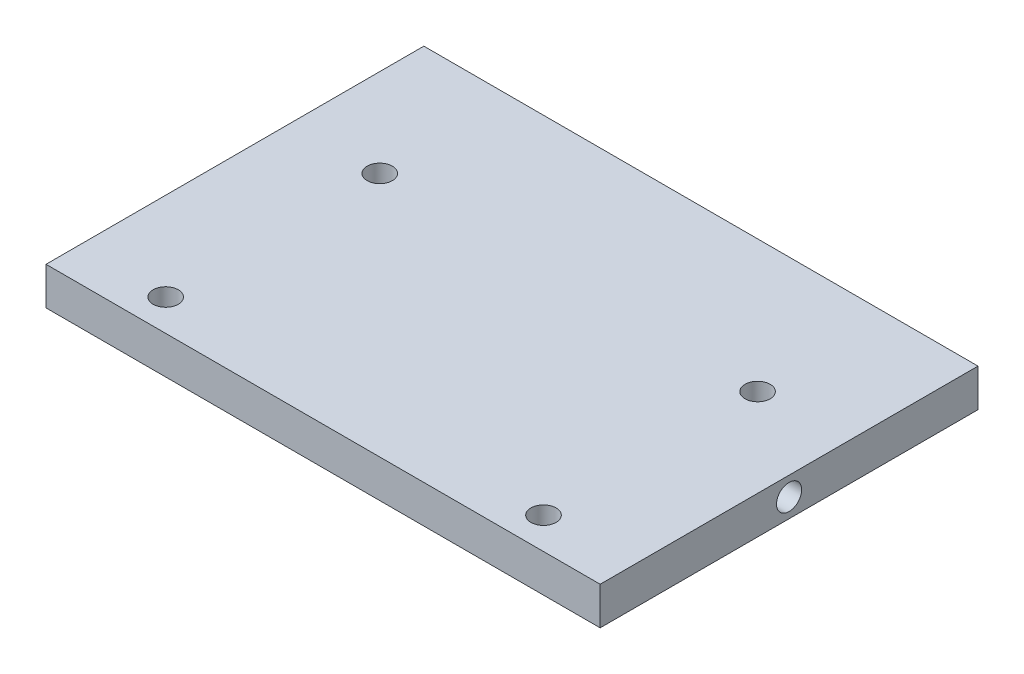
ISO-10303-21;
HEADER;
FILE_DESCRIPTION(('STEP AP214'),'2;1');
FILE_NAME('part.step','',(''),(''),'','','');
FILE_SCHEMA(('AUTOMOTIVE_DESIGN { 1 0 10303 214 1 1 1 1 }'));
ENDSEC;
DATA;
#1=APPLICATION_CONTEXT('core data for automotive mechanical design processes');
#2=APPLICATION_PROTOCOL_DEFINITION('international standard','automotive_design',2000,#1);
#3=PRODUCT_CONTEXT('',#1,'mechanical');
#4=PRODUCT('Part','Part','',(#3));
#5=PRODUCT_RELATED_PRODUCT_CATEGORY('part','',(#4));
#6=PRODUCT_DEFINITION_FORMATION('','',#4);
#7=PRODUCT_DEFINITION_CONTEXT('part definition',#1,'design');
#8=PRODUCT_DEFINITION('design','',#6,#7);
#9=PRODUCT_DEFINITION_SHAPE('','',#8);
#10=(LENGTH_UNIT() NAMED_UNIT(*) SI_UNIT(.MILLI.,.METRE.));
#11=(NAMED_UNIT(*) PLANE_ANGLE_UNIT() SI_UNIT($,.RADIAN.));
#12=(NAMED_UNIT(*) SI_UNIT($,.STERADIAN.) SOLID_ANGLE_UNIT());
#13=UNCERTAINTY_MEASURE_WITH_UNIT(LENGTH_MEASURE(1.E-05),#10,'distance_accuracy_value','');
#14=(GEOMETRIC_REPRESENTATION_CONTEXT(3) GLOBAL_UNCERTAINTY_ASSIGNED_CONTEXT((#13)) GLOBAL_UNIT_ASSIGNED_CONTEXT((#10,
#11,#12)) REPRESENTATION_CONTEXT('',''));
#15=CARTESIAN_POINT('',(0.,0.,0.));
#16=DIRECTION('',(0.,0.,1.));
#17=DIRECTION('',(1.,0.,0.));
#18=AXIS2_PLACEMENT_3D('',#15,#16,#17);
#19=CARTESIAN_POINT('',(-22.,3.,-15.));
#20=DIRECTION('',(1.,0.,0.));
#21=DIRECTION('',(0.,0.,-1.));
#22=AXIS2_PLACEMENT_3D('',#19,#20,#21);
#23=PLANE('',#22);
#24=CARTESIAN_POINT('',(-22.,1.5,0.));
#25=DIRECTION('',(-1.,0.,0.));
#26=DIRECTION('',(0.,0.,1.));
#27=AXIS2_PLACEMENT_3D('',#24,#25,#26);
#28=CIRCLE('',#27,1.);
#29=CARTESIAN_POINT('',(-22.,1.5,0.999999999999998));
#30=VERTEX_POINT('',#29);
#31=EDGE_CURVE('E112',#30,#30,#28,.T.);
#32=ORIENTED_EDGE('',*,*,#31,.F.);
#33=EDGE_LOOP('',(#32));
#34=FACE_BOUND('',#33,.T.);
#35=DIRECTION('',(0.,0.,1.));
#36=VECTOR('',#35,1.);
#37=CARTESIAN_POINT('',(-22.,0.,-15.));
#38=LINE('',#37,#36);
#39=CARTESIAN_POINT('',(-22.,0.,-15.));
#40=VERTEX_POINT('',#39);
#41=CARTESIAN_POINT('',(-22.,0.,15.));
#42=VERTEX_POINT('',#41);
#43=EDGE_CURVE('E100',#40,#42,#38,.T.);
#44=ORIENTED_EDGE('',*,*,#43,.T.);
#45=DIRECTION('',(0.,-1.,0.));
#46=VECTOR('',#45,1.);
#47=CARTESIAN_POINT('',(-22.,3.,15.));
#48=LINE('',#47,#46);
#49=CARTESIAN_POINT('',(-22.,3.,15.));
#50=VERTEX_POINT('',#49);
#51=EDGE_CURVE('E11',#50,#42,#48,.T.);
#52=ORIENTED_EDGE('',*,*,#51,.F.);
#53=DIRECTION('',(0.,0.,1.));
#54=VECTOR('',#53,1.);
#55=CARTESIAN_POINT('',(-22.,3.,-15.));
#56=LINE('',#55,#54);
#57=CARTESIAN_POINT('',(-22.,3.,-15.));
#58=VERTEX_POINT('',#57);
#59=EDGE_CURVE('E86',#58,#50,#56,.T.);
#60=ORIENTED_EDGE('',*,*,#59,.F.);
#61=DIRECTION('',(0.,-1.,0.));
#62=VECTOR('',#61,1.);
#63=CARTESIAN_POINT('',(-22.,3.,-15.));
#64=LINE('',#63,#62);
#65=EDGE_CURVE('E53',#58,#40,#64,.T.);
#66=ORIENTED_EDGE('',*,*,#65,.T.);
#67=EDGE_LOOP('',(#44,#52,#60,#66));
#68=FACE_BOUND('',#67,.T.);
#69=ADVANCED_FACE('F37',(#34,#68),#23,.F.);
#70=CARTESIAN_POINT('',(-22.,3.,15.));
#71=DIRECTION('',(0.,0.,-1.));
#72=DIRECTION('',(-1.,0.,0.));
#73=AXIS2_PLACEMENT_3D('',#70,#71,#72);
#74=PLANE('',#73);
#75=DIRECTION('',(1.,0.,0.));
#76=VECTOR('',#75,1.);
#77=CARTESIAN_POINT('',(-22.,0.,15.));
#78=LINE('',#77,#76);
#79=CARTESIAN_POINT('',(22.,0.,15.));
#80=VERTEX_POINT('',#79);
#81=EDGE_CURVE('E91',#42,#80,#78,.T.);
#82=ORIENTED_EDGE('',*,*,#81,.T.);
#83=DIRECTION('',(0.,-1.,0.));
#84=VECTOR('',#83,1.);
#85=CARTESIAN_POINT('',(22.,3.,15.));
#86=LINE('',#85,#84);
#87=CARTESIAN_POINT('',(22.,3.,15.));
#88=VERTEX_POINT('',#87);
#89=EDGE_CURVE('E45',#88,#80,#86,.T.);
#90=ORIENTED_EDGE('',*,*,#89,.F.);
#91=DIRECTION('',(1.,0.,0.));
#92=VECTOR('',#91,1.);
#93=CARTESIAN_POINT('',(-22.,3.,15.));
#94=LINE('',#93,#92);
#95=EDGE_CURVE('E78',#50,#88,#94,.T.);
#96=ORIENTED_EDGE('',*,*,#95,.F.);
#97=ORIENTED_EDGE('',*,*,#51,.T.);
#98=EDGE_LOOP('',(#82,#90,#96,#97));
#99=FACE_BOUND('',#98,.T.);
#100=ADVANCED_FACE('F90',(#99),#74,.F.);
#101=CARTESIAN_POINT('',(22.,3.,-15.));
#102=DIRECTION('',(1.,0.,0.));
#103=DIRECTION('',(0.,0.,-1.));
#104=AXIS2_PLACEMENT_3D('',#101,#102,#103);
#105=PLANE('',#104);
#106=CARTESIAN_POINT('',(22.,1.5,0.));
#107=DIRECTION('',(-1.,0.,0.));
#108=DIRECTION('',(0.,0.,1.));
#109=AXIS2_PLACEMENT_3D('',#106,#107,#108);
#110=CIRCLE('',#109,1.);
#111=CARTESIAN_POINT('',(22.,1.5,0.999999999999998));
#112=VERTEX_POINT('',#111);
#113=EDGE_CURVE('E118',#112,#112,#110,.T.);
#114=ORIENTED_EDGE('',*,*,#113,.T.);
#115=EDGE_LOOP('',(#114));
#116=FACE_BOUND('',#115,.T.);
#117=DIRECTION('',(0.,0.,1.));
#118=VECTOR('',#117,1.);
#119=CARTESIAN_POINT('',(22.,0.,-15.));
#120=LINE('',#119,#118);
#121=CARTESIAN_POINT('',(22.,0.,-15.));
#122=VERTEX_POINT('',#121);
#123=EDGE_CURVE('E104',#122,#80,#120,.T.);
#124=ORIENTED_EDGE('',*,*,#123,.F.);
#125=DIRECTION('',(0.,-1.,0.));
#126=VECTOR('',#125,1.);
#127=CARTESIAN_POINT('',(22.,3.,-15.));
#128=LINE('',#127,#126);
#129=CARTESIAN_POINT('',(22.,3.,-15.));
#130=VERTEX_POINT('',#129);
#131=EDGE_CURVE('E67',#130,#122,#128,.T.);
#132=ORIENTED_EDGE('',*,*,#131,.F.);
#133=DIRECTION('',(0.,0.,1.));
#134=VECTOR('',#133,1.);
#135=CARTESIAN_POINT('',(22.,3.,-15.));
#136=LINE('',#135,#134);
#137=EDGE_CURVE('E85',#130,#88,#136,.T.);
#138=ORIENTED_EDGE('',*,*,#137,.T.);
#139=ORIENTED_EDGE('',*,*,#89,.T.);
#140=EDGE_LOOP('',(#124,#132,#138,#139));
#141=FACE_BOUND('',#140,.T.);
#142=ADVANCED_FACE('F94',(#116,#141),#105,.T.);
#143=CARTESIAN_POINT('',(-22.,3.,-15.));
#144=DIRECTION('',(0.,0.,-1.));
#145=DIRECTION('',(-1.,0.,0.));
#146=AXIS2_PLACEMENT_3D('',#143,#144,#145);
#147=PLANE('',#146);
#148=DIRECTION('',(1.,0.,0.));
#149=VECTOR('',#148,1.);
#150=CARTESIAN_POINT('',(-22.,0.,-15.));
#151=LINE('',#150,#149);
#152=EDGE_CURVE('E106',#40,#122,#151,.T.);
#153=ORIENTED_EDGE('',*,*,#152,.F.);
#154=ORIENTED_EDGE('',*,*,#65,.F.);
#155=DIRECTION('',(1.,0.,0.));
#156=VECTOR('',#155,1.);
#157=CARTESIAN_POINT('',(-22.,3.,-15.));
#158=LINE('',#157,#156);
#159=EDGE_CURVE('E95',#58,#130,#158,.T.);
#160=ORIENTED_EDGE('',*,*,#159,.T.);
#161=ORIENTED_EDGE('',*,*,#131,.T.);
#162=EDGE_LOOP('',(#153,#154,#160,#161));
#163=FACE_BOUND('',#162,.T.);
#164=ADVANCED_FACE('F157',(#163),#147,.T.);
#165=CARTESIAN_POINT('',(0.,3.,0.));
#166=DIRECTION('',(0.,1.,0.));
#167=DIRECTION('',(0.,0.,1.));
#168=AXIS2_PLACEMENT_3D('',#165,#166,#167);
#169=PLANE('',#168);
#170=CARTESIAN_POINT('',(15.,3.,-4.50000000000001));
#171=DIRECTION('',(0.,1.,0.));
#172=DIRECTION('',(0.,0.,1.));
#173=AXIS2_PLACEMENT_3D('',#170,#171,#172);
#174=CIRCLE('',#173,1.);
#175=CARTESIAN_POINT('',(15.,3.,-3.50000000000001));
#176=VERTEX_POINT('',#175);
#177=EDGE_CURVE('E121',#176,#176,#174,.T.);
#178=ORIENTED_EDGE('',*,*,#177,.F.);
#179=EDGE_LOOP('',(#178));
#180=FACE_BOUND('',#179,.T.);
#181=CARTESIAN_POINT('',(15.,3.,12.5));
#182=DIRECTION('',(0.,1.,0.));
#183=DIRECTION('',(0.,0.,1.));
#184=AXIS2_PLACEMENT_3D('',#181,#182,#183);
#185=CIRCLE('',#184,1.);
#186=CARTESIAN_POINT('',(15.,3.,13.5));
#187=VERTEX_POINT('',#186);
#188=EDGE_CURVE('E126',#187,#187,#185,.T.);
#189=ORIENTED_EDGE('',*,*,#188,.F.);
#190=EDGE_LOOP('',(#189));
#191=FACE_BOUND('',#190,.T.);
#192=CARTESIAN_POINT('',(-15.,3.,12.5));
#193=DIRECTION('',(0.,1.,0.));
#194=DIRECTION('',(0.,0.,1.));
#195=AXIS2_PLACEMENT_3D('',#192,#193,#194);
#196=CIRCLE('',#195,1.);
#197=CARTESIAN_POINT('',(-15.,3.,13.5));
#198=VERTEX_POINT('',#197);
#199=EDGE_CURVE('E129',#198,#198,#196,.T.);
#200=ORIENTED_EDGE('',*,*,#199,.F.);
#201=EDGE_LOOP('',(#200));
#202=FACE_BOUND('',#201,.T.);
#203=CARTESIAN_POINT('',(-15.,3.,-4.50000000000001));
#204=DIRECTION('',(0.,1.,0.));
#205=DIRECTION('',(0.,0.,1.));
#206=AXIS2_PLACEMENT_3D('',#203,#204,#205);
#207=CIRCLE('',#206,1.);
#208=CARTESIAN_POINT('',(-15.,3.,-3.50000000000001));
#209=VERTEX_POINT('',#208);
#210=EDGE_CURVE('E132',#209,#209,#207,.T.);
#211=ORIENTED_EDGE('',*,*,#210,.F.);
#212=EDGE_LOOP('',(#211));
#213=FACE_BOUND('',#212,.T.);
#214=ORIENTED_EDGE('',*,*,#59,.T.);
#215=ORIENTED_EDGE('',*,*,#95,.T.);
#216=ORIENTED_EDGE('',*,*,#137,.F.);
#217=ORIENTED_EDGE('',*,*,#159,.F.);
#218=EDGE_LOOP('',(#214,#215,#216,#217));
#219=FACE_BOUND('',#218,.T.);
#220=ADVANCED_FACE('F82',(#180,#191,#202,#213,#219),#169,.T.);
#221=CARTESIAN_POINT('',(0.,0.,0.));
#222=DIRECTION('',(0.,1.,0.));
#223=DIRECTION('',(0.,0.,1.));
#224=AXIS2_PLACEMENT_3D('',#221,#222,#223);
#225=PLANE('',#224);
#226=CARTESIAN_POINT('',(15.,0.,-4.50000000000001));
#227=DIRECTION('',(0.,-1.,0.));
#228=DIRECTION('',(0.,0.,-1.));
#229=AXIS2_PLACEMENT_3D('',#226,#227,#228);
#230=CIRCLE('',#229,1.);
#231=CARTESIAN_POINT('',(15.,0.,-5.50000000000001));
#232=VERTEX_POINT('',#231);
#233=EDGE_CURVE('E139',#232,#232,#230,.T.);
#234=ORIENTED_EDGE('',*,*,#233,.F.);
#235=EDGE_LOOP('',(#234));
#236=FACE_BOUND('',#235,.T.);
#237=CARTESIAN_POINT('',(15.,0.,12.5));
#238=DIRECTION('',(0.,-1.,0.));
#239=DIRECTION('',(0.,0.,-1.));
#240=AXIS2_PLACEMENT_3D('',#237,#238,#239);
#241=CIRCLE('',#240,1.);
#242=CARTESIAN_POINT('',(15.,0.,11.5));
#243=VERTEX_POINT('',#242);
#244=EDGE_CURVE('E142',#243,#243,#241,.T.);
#245=ORIENTED_EDGE('',*,*,#244,.F.);
#246=EDGE_LOOP('',(#245));
#247=FACE_BOUND('',#246,.T.);
#248=CARTESIAN_POINT('',(-15.,0.,12.5));
#249=DIRECTION('',(0.,-1.,0.));
#250=DIRECTION('',(0.,0.,-1.));
#251=AXIS2_PLACEMENT_3D('',#248,#249,#250);
#252=CIRCLE('',#251,1.);
#253=CARTESIAN_POINT('',(-15.,0.,11.5));
#254=VERTEX_POINT('',#253);
#255=EDGE_CURVE('E138',#254,#254,#252,.T.);
#256=ORIENTED_EDGE('',*,*,#255,.F.);
#257=EDGE_LOOP('',(#256));
#258=FACE_BOUND('',#257,.T.);
#259=CARTESIAN_POINT('',(-15.,0.,-4.50000000000001));
#260=DIRECTION('',(0.,-1.,0.));
#261=DIRECTION('',(0.,0.,-1.));
#262=AXIS2_PLACEMENT_3D('',#259,#260,#261);
#263=CIRCLE('',#262,1.);
#264=CARTESIAN_POINT('',(-15.,0.,-5.50000000000001));
#265=VERTEX_POINT('',#264);
#266=EDGE_CURVE('E135',#265,#265,#263,.T.);
#267=ORIENTED_EDGE('',*,*,#266,.F.);
#268=EDGE_LOOP('',(#267));
#269=FACE_BOUND('',#268,.T.);
#270=ORIENTED_EDGE('',*,*,#43,.F.);
#271=ORIENTED_EDGE('',*,*,#152,.T.);
#272=ORIENTED_EDGE('',*,*,#123,.T.);
#273=ORIENTED_EDGE('',*,*,#81,.F.);
#274=EDGE_LOOP('',(#270,#271,#272,#273));
#275=FACE_BOUND('',#274,.T.);
#276=ADVANCED_FACE('F150',(#236,#247,#258,#269,#275),#225,.F.);
#277=CARTESIAN_POINT('',(-17.,1.5,0.));
#278=DIRECTION('',(-1.,0.,0.));
#279=DIRECTION('',(0.,0.,1.));
#280=AXIS2_PLACEMENT_3D('',#277,#278,#279);
#281=CYLINDRICAL_SURFACE('',#280,1.);
#282=CARTESIAN_POINT('',(-17.,1.5,0.));
#283=DIRECTION('',(-1.,0.,0.));
#284=DIRECTION('',(0.,0.,1.));
#285=AXIS2_PLACEMENT_3D('',#282,#283,#284);
#286=CIRCLE('',#285,1.);
#287=CARTESIAN_POINT('',(-17.,1.5,0.999999999999998));
#288=VERTEX_POINT('',#287);
#289=EDGE_CURVE('E102',#288,#288,#286,.T.);
#290=ORIENTED_EDGE('',*,*,#289,.F.);
#291=EDGE_LOOP('',(#290));
#292=FACE_BOUND('',#291,.T.);
#293=ORIENTED_EDGE('',*,*,#31,.T.);
#294=EDGE_LOOP('',(#293));
#295=FACE_BOUND('',#294,.T.);
#296=ADVANCED_FACE('F153',(#292,#295),#281,.F.);
#297=CARTESIAN_POINT('',(-17.,1.5,0.));
#298=DIRECTION('',(-1.,0.,0.));
#299=DIRECTION('',(0.,0.,1.));
#300=AXIS2_PLACEMENT_3D('',#297,#298,#299);
#301=PLANE('',#300);
#302=ORIENTED_EDGE('',*,*,#289,.T.);
#303=EDGE_LOOP('',(#302));
#304=FACE_BOUND('',#303,.T.);
#305=ADVANCED_FACE('F179',(#304),#301,.T.);
#306=CARTESIAN_POINT('',(17.,1.5,0.));
#307=DIRECTION('',(1.,0.,0.));
#308=DIRECTION('',(0.,0.,-1.));
#309=AXIS2_PLACEMENT_3D('',#306,#307,#308);
#310=CYLINDRICAL_SURFACE('',#309,1.);
#311=CARTESIAN_POINT('',(17.,1.5,0.));
#312=DIRECTION('',(-1.,0.,0.));
#313=DIRECTION('',(0.,0.,1.));
#314=AXIS2_PLACEMENT_3D('',#311,#312,#313);
#315=CIRCLE('',#314,1.);
#316=CARTESIAN_POINT('',(17.,1.5,0.999999999999998));
#317=VERTEX_POINT('',#316);
#318=EDGE_CURVE('E115',#317,#317,#315,.T.);
#319=ORIENTED_EDGE('',*,*,#318,.T.);
#320=EDGE_LOOP('',(#319));
#321=FACE_BOUND('',#320,.T.);
#322=ORIENTED_EDGE('',*,*,#113,.F.);
#323=EDGE_LOOP('',(#322));
#324=FACE_BOUND('',#323,.T.);
#325=ADVANCED_FACE('F185',(#321,#324),#310,.F.);
#326=CARTESIAN_POINT('',(17.,1.5,0.));
#327=DIRECTION('',(1.,0.,0.));
#328=DIRECTION('',(0.,0.,1.));
#329=AXIS2_PLACEMENT_3D('',#326,#327,#328);
#330=PLANE('',#329);
#331=ORIENTED_EDGE('',*,*,#318,.F.);
#332=EDGE_LOOP('',(#331));
#333=FACE_BOUND('',#332,.T.);
#334=ADVANCED_FACE('F192',(#333),#330,.T.);
#335=CARTESIAN_POINT('',(-15.,5.,-4.50000000000001));
#336=DIRECTION('',(0.,-1.,0.));
#337=DIRECTION('',(0.,0.,-1.));
#338=AXIS2_PLACEMENT_3D('',#335,#336,#337);
#339=CYLINDRICAL_SURFACE('',#338,1.);
#340=ORIENTED_EDGE('',*,*,#210,.T.);
#341=EDGE_LOOP('',(#340));
#342=FACE_BOUND('',#341,.T.);
#343=ORIENTED_EDGE('',*,*,#266,.T.);
#344=EDGE_LOOP('',(#343));
#345=FACE_BOUND('',#344,.T.);
#346=ADVANCED_FACE('F196',(#342,#345),#339,.F.);
#347=CARTESIAN_POINT('',(-15.,5.,12.5));
#348=DIRECTION('',(0.,-1.,0.));
#349=DIRECTION('',(0.,0.,-1.));
#350=AXIS2_PLACEMENT_3D('',#347,#348,#349);
#351=CYLINDRICAL_SURFACE('',#350,1.);
#352=ORIENTED_EDGE('',*,*,#199,.T.);
#353=EDGE_LOOP('',(#352));
#354=FACE_BOUND('',#353,.T.);
#355=ORIENTED_EDGE('',*,*,#255,.T.);
#356=EDGE_LOOP('',(#355));
#357=FACE_BOUND('',#356,.T.);
#358=ADVANCED_FACE('F148',(#354,#357),#351,.F.);
#359=CARTESIAN_POINT('',(15.,5.,12.5));
#360=DIRECTION('',(0.,-1.,0.));
#361=DIRECTION('',(0.,0.,-1.));
#362=AXIS2_PLACEMENT_3D('',#359,#360,#361);
#363=CYLINDRICAL_SURFACE('',#362,1.);
#364=ORIENTED_EDGE('',*,*,#188,.T.);
#365=EDGE_LOOP('',(#364));
#366=FACE_BOUND('',#365,.T.);
#367=ORIENTED_EDGE('',*,*,#244,.T.);
#368=EDGE_LOOP('',(#367));
#369=FACE_BOUND('',#368,.T.);
#370=ADVANCED_FACE('F204',(#366,#369),#363,.F.);
#371=CARTESIAN_POINT('',(15.,5.,-4.50000000000001));
#372=DIRECTION('',(0.,-1.,0.));
#373=DIRECTION('',(0.,0.,-1.));
#374=AXIS2_PLACEMENT_3D('',#371,#372,#373);
#375=CYLINDRICAL_SURFACE('',#374,1.);
#376=ORIENTED_EDGE('',*,*,#177,.T.);
#377=EDGE_LOOP('',(#376));
#378=FACE_BOUND('',#377,.T.);
#379=ORIENTED_EDGE('',*,*,#233,.T.);
#380=EDGE_LOOP('',(#379));
#381=FACE_BOUND('',#380,.T.);
#382=ADVANCED_FACE('F201',(#378,#381),#375,.F.);
#383=CLOSED_SHELL('',(#69,#100,#142,#164,#220,#276,#296,#305,#325,#334,#346,#358,#370,#382));
#384=MANIFOLD_SOLID_BREP('B2',#383);
#385=ADVANCED_BREP_SHAPE_REPRESENTATION('',(#18,#384),#14);
#386=SHAPE_DEFINITION_REPRESENTATION(#9,#385);
ENDSEC;
END-ISO-10303-21;
